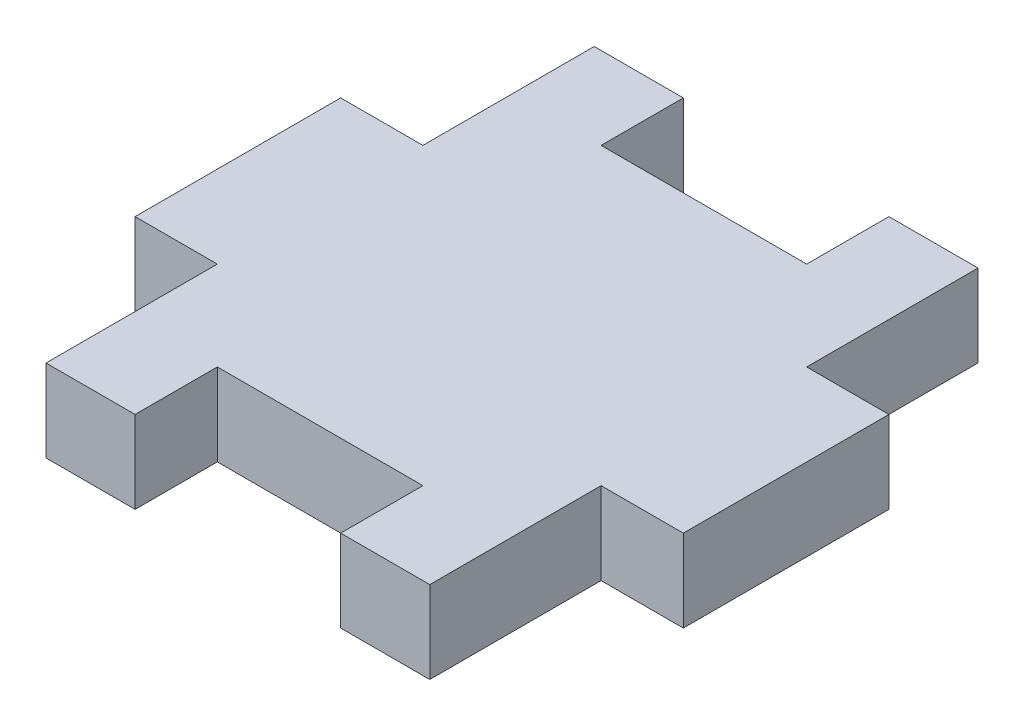
ISO-10303-21;
HEADER;
FILE_DESCRIPTION(('STEP AP214'),'2;1');
FILE_NAME('part.step','',(''),(''),'','','');
FILE_SCHEMA(('AUTOMOTIVE_DESIGN { 1 0 10303 214 1 1 1 1 }'));
ENDSEC;
DATA;
#1=APPLICATION_CONTEXT('core data for automotive mechanical design processes');
#2=APPLICATION_PROTOCOL_DEFINITION('international standard','automotive_design',2000,#1);
#3=PRODUCT_CONTEXT('',#1,'mechanical');
#4=PRODUCT('Part','Part','',(#3));
#5=PRODUCT_RELATED_PRODUCT_CATEGORY('part','',(#4));
#6=PRODUCT_DEFINITION_FORMATION('','',#4);
#7=PRODUCT_DEFINITION_CONTEXT('part definition',#1,'design');
#8=PRODUCT_DEFINITION('design','',#6,#7);
#9=PRODUCT_DEFINITION_SHAPE('','',#8);
#10=(LENGTH_UNIT() NAMED_UNIT(*) SI_UNIT(.MILLI.,.METRE.));
#11=(NAMED_UNIT(*) PLANE_ANGLE_UNIT() SI_UNIT($,.RADIAN.));
#12=(NAMED_UNIT(*) SI_UNIT($,.STERADIAN.) SOLID_ANGLE_UNIT());
#13=UNCERTAINTY_MEASURE_WITH_UNIT(LENGTH_MEASURE(1.E-05),#10,'distance_accuracy_value','');
#14=(GEOMETRIC_REPRESENTATION_CONTEXT(3) GLOBAL_UNCERTAINTY_ASSIGNED_CONTEXT((#13)) GLOBAL_UNIT_ASSIGNED_CONTEXT((#10,
#11,#12)) REPRESENTATION_CONTEXT('',''));
#15=CARTESIAN_POINT('',(0.,0.,0.));
#16=DIRECTION('',(0.,0.,1.));
#17=DIRECTION('',(1.,0.,0.));
#18=AXIS2_PLACEMENT_3D('',#15,#16,#17);
#19=CARTESIAN_POINT('',(0.,6.,0.));
#20=DIRECTION('',(0.,0.,-1.));
#21=DIRECTION('',(-1.,0.,0.));
#22=AXIS2_PLACEMENT_3D('',#19,#20,#21);
#23=PLANE('',#22);
#24=DIRECTION('',(1.,0.,0.));
#25=VECTOR('',#24,1.);
#26=CARTESIAN_POINT('',(0.,0.,0.));
#27=LINE('',#26,#25);
#28=CARTESIAN_POINT('',(6.,0.,0.));
#29=VERTEX_POINT('',#28);
#30=CARTESIAN_POINT('',(12.5,0.,0.));
#31=VERTEX_POINT('',#30);
#32=EDGE_CURVE('E218',#29,#31,#27,.T.);
#33=ORIENTED_EDGE('',*,*,#32,.T.);
#34=DIRECTION('',(0.,-1.,0.));
#35=VECTOR('',#34,1.);
#36=CARTESIAN_POINT('',(12.5,6.,0.));
#37=LINE('',#36,#35);
#38=CARTESIAN_POINT('',(12.5,6.,0.));
#39=VERTEX_POINT('',#38);
#40=EDGE_CURVE('E11',#39,#31,#37,.T.);
#41=ORIENTED_EDGE('',*,*,#40,.F.);
#42=DIRECTION('',(1.,0.,0.));
#43=VECTOR('',#42,1.);
#44=CARTESIAN_POINT('',(0.,6.,0.));
#45=LINE('',#44,#43);
#46=CARTESIAN_POINT('',(6.,6.,0.));
#47=VERTEX_POINT('',#46);
#48=EDGE_CURVE('E286',#47,#39,#45,.T.);
#49=ORIENTED_EDGE('',*,*,#48,.F.);
#50=DIRECTION('',(0.,-1.,0.));
#51=VECTOR('',#50,1.);
#52=CARTESIAN_POINT('',(6.,6.,0.));
#53=LINE('',#52,#51);
#54=EDGE_CURVE('E59',#47,#29,#53,.T.);
#55=ORIENTED_EDGE('',*,*,#54,.T.);
#56=EDGE_LOOP('',(#33,#41,#49,#55));
#57=FACE_BOUND('',#56,.T.);
#58=ADVANCED_FACE('F41',(#57),#23,.F.);
#59=CARTESIAN_POINT('',(12.5,6.,0.));
#60=DIRECTION('',(-1.,0.,0.));
#61=DIRECTION('',(0.,0.,1.));
#62=AXIS2_PLACEMENT_3D('',#59,#60,#61);
#63=PLANE('',#62);
#64=DIRECTION('',(0.,0.,-1.));
#65=VECTOR('',#64,1.);
#66=CARTESIAN_POINT('',(12.5,0.,0.));
#67=LINE('',#66,#65);
#68=CARTESIAN_POINT('',(12.5,0.,-6.));
#69=VERTEX_POINT('',#68);
#70=EDGE_CURVE('E221',#31,#69,#67,.T.);
#71=ORIENTED_EDGE('',*,*,#70,.T.);
#72=DIRECTION('',(0.,-1.,0.));
#73=VECTOR('',#72,1.);
#74=CARTESIAN_POINT('',(12.5,6.,-6.));
#75=LINE('',#74,#73);
#76=CARTESIAN_POINT('',(12.5,6.,-6.));
#77=VERTEX_POINT('',#76);
#78=EDGE_CURVE('E51',#77,#69,#75,.T.);
#79=ORIENTED_EDGE('',*,*,#78,.F.);
#80=DIRECTION('',(0.,0.,-1.));
#81=VECTOR('',#80,1.);
#82=CARTESIAN_POINT('',(12.5,6.,0.));
#83=LINE('',#82,#81);
#84=EDGE_CURVE('E134',#39,#77,#83,.T.);
#85=ORIENTED_EDGE('',*,*,#84,.F.);
#86=ORIENTED_EDGE('',*,*,#40,.T.);
#87=EDGE_LOOP('',(#71,#79,#85,#86));
#88=FACE_BOUND('',#87,.T.);
#89=ADVANCED_FACE('F43',(#88),#63,.F.);
#90=CARTESIAN_POINT('',(0.,6.,-6.));
#91=DIRECTION('',(0.,0.,-1.));
#92=DIRECTION('',(-1.,0.,0.));
#93=AXIS2_PLACEMENT_3D('',#90,#91,#92);
#94=PLANE('',#93);
#95=DIRECTION('',(1.,0.,0.));
#96=VECTOR('',#95,1.);
#97=CARTESIAN_POINT('',(0.,0.,-6.));
#98=LINE('',#97,#96);
#99=CARTESIAN_POINT('',(27.5,0.,-6.));
#100=VERTEX_POINT('',#99);
#101=EDGE_CURVE('E225',#69,#100,#98,.T.);
#102=ORIENTED_EDGE('',*,*,#101,.T.);
#103=DIRECTION('',(0.,-1.,0.));
#104=VECTOR('',#103,1.);
#105=CARTESIAN_POINT('',(27.5,6.,-6.));
#106=LINE('',#105,#104);
#107=CARTESIAN_POINT('',(27.5,6.,-6.));
#108=VERTEX_POINT('',#107);
#109=EDGE_CURVE('E334',#108,#100,#106,.T.);
#110=ORIENTED_EDGE('',*,*,#109,.F.);
#111=DIRECTION('',(1.,0.,0.));
#112=VECTOR('',#111,1.);
#113=CARTESIAN_POINT('',(0.,6.,-6.));
#114=LINE('',#113,#112);
#115=EDGE_CURVE('E343',#77,#108,#114,.T.);
#116=ORIENTED_EDGE('',*,*,#115,.F.);
#117=ORIENTED_EDGE('',*,*,#78,.T.);
#118=EDGE_LOOP('',(#102,#110,#116,#117));
#119=FACE_BOUND('',#118,.T.);
#120=ADVANCED_FACE('F341',(#119),#94,.F.);
#121=CARTESIAN_POINT('',(27.5,6.,0.));
#122=DIRECTION('',(-1.,0.,0.));
#123=DIRECTION('',(0.,0.,1.));
#124=AXIS2_PLACEMENT_3D('',#121,#122,#123);
#125=PLANE('',#124);
#126=DIRECTION('',(0.,0.,-1.));
#127=VECTOR('',#126,1.);
#128=CARTESIAN_POINT('',(27.5,0.,0.));
#129=LINE('',#128,#127);
#130=CARTESIAN_POINT('',(27.5,0.,0.));
#131=VERTEX_POINT('',#130);
#132=EDGE_CURVE('E229',#131,#100,#129,.T.);
#133=ORIENTED_EDGE('',*,*,#132,.F.);
#134=DIRECTION('',(0.,-1.,0.));
#135=VECTOR('',#134,1.);
#136=CARTESIAN_POINT('',(27.5,6.,0.));
#137=LINE('',#136,#135);
#138=CARTESIAN_POINT('',(27.5,6.,0.));
#139=VERTEX_POINT('',#138);
#140=EDGE_CURVE('E331',#139,#131,#137,.T.);
#141=ORIENTED_EDGE('',*,*,#140,.F.);
#142=DIRECTION('',(0.,0.,-1.));
#143=VECTOR('',#142,1.);
#144=CARTESIAN_POINT('',(27.5,6.,0.));
#145=LINE('',#144,#143);
#146=EDGE_CURVE('E354',#139,#108,#145,.T.);
#147=ORIENTED_EDGE('',*,*,#146,.T.);
#148=ORIENTED_EDGE('',*,*,#109,.T.);
#149=EDGE_LOOP('',(#133,#141,#147,#148));
#150=FACE_BOUND('',#149,.T.);
#151=ADVANCED_FACE('F350',(#150),#125,.T.);
#152=CARTESIAN_POINT('',(34.,0.,0.));
#153=VERTEX_POINT('',#152);
#154=EDGE_CURVE('E222',#131,#153,#27,.T.);
#155=ORIENTED_EDGE('',*,*,#154,.T.);
#156=DIRECTION('',(0.,-1.,0.));
#157=VECTOR('',#156,1.);
#158=CARTESIAN_POINT('',(34.,6.,0.));
#159=LINE('',#158,#157);
#160=CARTESIAN_POINT('',(34.,6.,0.));
#161=VERTEX_POINT('',#160);
#162=EDGE_CURVE('E327',#161,#153,#159,.T.);
#163=ORIENTED_EDGE('',*,*,#162,.F.);
#164=EDGE_CURVE('E356',#139,#161,#45,.T.);
#165=ORIENTED_EDGE('',*,*,#164,.F.);
#166=ORIENTED_EDGE('',*,*,#140,.T.);
#167=EDGE_LOOP('',(#155,#163,#165,#166));
#168=FACE_BOUND('',#167,.T.);
#169=ADVANCED_FACE('F417',(#168),#23,.F.);
#170=CARTESIAN_POINT('',(34.,6.,0.));
#171=DIRECTION('',(-1.,0.,0.));
#172=DIRECTION('',(0.,0.,1.));
#173=AXIS2_PLACEMENT_3D('',#170,#171,#172);
#174=PLANE('',#173);
#175=DIRECTION('',(0.,0.,-1.));
#176=VECTOR('',#175,1.);
#177=CARTESIAN_POINT('',(34.,0.,0.));
#178=LINE('',#177,#176);
#179=CARTESIAN_POINT('',(34.,0.,-12.5));
#180=VERTEX_POINT('',#179);
#181=EDGE_CURVE('E233',#153,#180,#178,.T.);
#182=ORIENTED_EDGE('',*,*,#181,.T.);
#183=DIRECTION('',(0.,-1.,0.));
#184=VECTOR('',#183,1.);
#185=CARTESIAN_POINT('',(34.,6.,-12.5));
#186=LINE('',#185,#184);
#187=CARTESIAN_POINT('',(34.,6.,-12.5));
#188=VERTEX_POINT('',#187);
#189=EDGE_CURVE('E324',#188,#180,#186,.T.);
#190=ORIENTED_EDGE('',*,*,#189,.F.);
#191=DIRECTION('',(0.,0.,-1.));
#192=VECTOR('',#191,1.);
#193=CARTESIAN_POINT('',(34.,6.,0.));
#194=LINE('',#193,#192);
#195=EDGE_CURVE('E360',#161,#188,#194,.T.);
#196=ORIENTED_EDGE('',*,*,#195,.F.);
#197=ORIENTED_EDGE('',*,*,#162,.T.);
#198=EDGE_LOOP('',(#182,#190,#196,#197));
#199=FACE_BOUND('',#198,.T.);
#200=ADVANCED_FACE('F420',(#199),#174,.F.);
#201=CARTESIAN_POINT('',(0.,6.,-12.5));
#202=DIRECTION('',(0.,0.,1.));
#203=DIRECTION('',(1.,0.,0.));
#204=AXIS2_PLACEMENT_3D('',#201,#202,#203);
#205=PLANE('',#204);
#206=DIRECTION('',(-1.,0.,0.));
#207=VECTOR('',#206,1.);
#208=CARTESIAN_POINT('',(0.,0.,-12.5));
#209=LINE('',#208,#207);
#210=CARTESIAN_POINT('',(40.,0.,-12.5));
#211=VERTEX_POINT('',#210);
#212=EDGE_CURVE('E237',#211,#180,#209,.T.);
#213=ORIENTED_EDGE('',*,*,#212,.F.);
#214=DIRECTION('',(0.,-1.,0.));
#215=VECTOR('',#214,1.);
#216=CARTESIAN_POINT('',(40.,6.,-12.5));
#217=LINE('',#216,#215);
#218=CARTESIAN_POINT('',(40.,6.,-12.5));
#219=VERTEX_POINT('',#218);
#220=EDGE_CURVE('E321',#219,#211,#217,.T.);
#221=ORIENTED_EDGE('',*,*,#220,.F.);
#222=DIRECTION('',(-1.,0.,0.));
#223=VECTOR('',#222,1.);
#224=CARTESIAN_POINT('',(0.,6.,-12.5));
#225=LINE('',#224,#223);
#226=EDGE_CURVE('E367',#219,#188,#225,.T.);
#227=ORIENTED_EDGE('',*,*,#226,.T.);
#228=ORIENTED_EDGE('',*,*,#189,.T.);
#229=EDGE_LOOP('',(#213,#221,#227,#228));
#230=FACE_BOUND('',#229,.T.);
#231=ADVANCED_FACE('F426',(#230),#205,.T.);
#232=CARTESIAN_POINT('',(40.,6.,0.));
#233=DIRECTION('',(-1.,0.,0.));
#234=DIRECTION('',(0.,0.,1.));
#235=AXIS2_PLACEMENT_3D('',#232,#233,#234);
#236=PLANE('',#235);
#237=DIRECTION('',(0.,0.,-1.));
#238=VECTOR('',#237,1.);
#239=CARTESIAN_POINT('',(40.,0.,0.));
#240=LINE('',#239,#238);
#241=CARTESIAN_POINT('',(40.,0.,-27.5));
#242=VERTEX_POINT('',#241);
#243=EDGE_CURVE('E241',#211,#242,#240,.T.);
#244=ORIENTED_EDGE('',*,*,#243,.T.);
#245=DIRECTION('',(0.,-1.,0.));
#246=VECTOR('',#245,1.);
#247=CARTESIAN_POINT('',(40.,6.,-27.5));
#248=LINE('',#247,#246);
#249=CARTESIAN_POINT('',(40.,6.,-27.5));
#250=VERTEX_POINT('',#249);
#251=EDGE_CURVE('E317',#250,#242,#248,.T.);
#252=ORIENTED_EDGE('',*,*,#251,.F.);
#253=DIRECTION('',(0.,0.,-1.));
#254=VECTOR('',#253,1.);
#255=CARTESIAN_POINT('',(40.,6.,0.));
#256=LINE('',#255,#254);
#257=EDGE_CURVE('E371',#219,#250,#256,.T.);
#258=ORIENTED_EDGE('',*,*,#257,.F.);
#259=ORIENTED_EDGE('',*,*,#220,.T.);
#260=EDGE_LOOP('',(#244,#252,#258,#259));
#261=FACE_BOUND('',#260,.T.);
#262=ADVANCED_FACE('F434',(#261),#236,.F.);
#263=CARTESIAN_POINT('',(0.,6.,-27.5));
#264=DIRECTION('',(0.,0.,1.));
#265=DIRECTION('',(1.,0.,0.));
#266=AXIS2_PLACEMENT_3D('',#263,#264,#265);
#267=PLANE('',#266);
#268=DIRECTION('',(-1.,0.,0.));
#269=VECTOR('',#268,1.);
#270=CARTESIAN_POINT('',(0.,0.,-27.5));
#271=LINE('',#270,#269);
#272=CARTESIAN_POINT('',(34.,0.,-27.5));
#273=VERTEX_POINT('',#272);
#274=EDGE_CURVE('E244',#242,#273,#271,.T.);
#275=ORIENTED_EDGE('',*,*,#274,.T.);
#276=DIRECTION('',(0.,-1.,0.));
#277=VECTOR('',#276,1.);
#278=CARTESIAN_POINT('',(34.,6.,-27.5));
#279=LINE('',#278,#277);
#280=CARTESIAN_POINT('',(34.,6.,-27.5));
#281=VERTEX_POINT('',#280);
#282=EDGE_CURVE('E314',#281,#273,#279,.T.);
#283=ORIENTED_EDGE('',*,*,#282,.F.);
#284=DIRECTION('',(-1.,0.,0.));
#285=VECTOR('',#284,1.);
#286=CARTESIAN_POINT('',(0.,6.,-27.5));
#287=LINE('',#286,#285);
#288=EDGE_CURVE('E374',#250,#281,#287,.T.);
#289=ORIENTED_EDGE('',*,*,#288,.F.);
#290=ORIENTED_EDGE('',*,*,#251,.T.);
#291=EDGE_LOOP('',(#275,#283,#289,#290));
#292=FACE_BOUND('',#291,.T.);
#293=ADVANCED_FACE('F436',(#292),#267,.F.);
#294=CARTESIAN_POINT('',(34.,6.,0.));
#295=DIRECTION('',(1.,0.,0.));
#296=DIRECTION('',(0.,0.,-1.));
#297=AXIS2_PLACEMENT_3D('',#294,#295,#296);
#298=PLANE('',#297);
#299=DIRECTION('',(0.,0.,1.));
#300=VECTOR('',#299,1.);
#301=CARTESIAN_POINT('',(34.,0.,0.));
#302=LINE('',#301,#300);
#303=CARTESIAN_POINT('',(34.,0.,-40.));
#304=VERTEX_POINT('',#303);
#305=EDGE_CURVE('E248',#304,#273,#302,.T.);
#306=ORIENTED_EDGE('',*,*,#305,.F.);
#307=DIRECTION('',(0.,-1.,0.));
#308=VECTOR('',#307,1.);
#309=CARTESIAN_POINT('',(34.,6.,-40.));
#310=LINE('',#309,#308);
#311=CARTESIAN_POINT('',(34.,6.,-40.));
#312=VERTEX_POINT('',#311);
#313=EDGE_CURVE('E311',#312,#304,#310,.T.);
#314=ORIENTED_EDGE('',*,*,#313,.F.);
#315=DIRECTION('',(0.,0.,1.));
#316=VECTOR('',#315,1.);
#317=CARTESIAN_POINT('',(34.,6.,0.));
#318=LINE('',#317,#316);
#319=EDGE_CURVE('E377',#312,#281,#318,.T.);
#320=ORIENTED_EDGE('',*,*,#319,.T.);
#321=ORIENTED_EDGE('',*,*,#282,.T.);
#322=EDGE_LOOP('',(#306,#314,#320,#321));
#323=FACE_BOUND('',#322,.T.);
#324=ADVANCED_FACE('F439',(#323),#298,.T.);
#325=CARTESIAN_POINT('',(0.,6.,-40.));
#326=DIRECTION('',(0.,0.,-1.));
#327=DIRECTION('',(-1.,0.,0.));
#328=AXIS2_PLACEMENT_3D('',#325,#326,#327);
#329=PLANE('',#328);
#330=DIRECTION('',(1.,0.,0.));
#331=VECTOR('',#330,1.);
#332=CARTESIAN_POINT('',(0.,0.,-40.));
#333=LINE('',#332,#331);
#334=CARTESIAN_POINT('',(27.5,0.,-40.));
#335=VERTEX_POINT('',#334);
#336=EDGE_CURVE('E252',#335,#304,#333,.T.);
#337=ORIENTED_EDGE('',*,*,#336,.F.);
#338=DIRECTION('',(0.,-1.,0.));
#339=VECTOR('',#338,1.);
#340=CARTESIAN_POINT('',(27.5,6.,-40.));
#341=LINE('',#340,#339);
#342=CARTESIAN_POINT('',(27.5,6.,-40.));
#343=VERTEX_POINT('',#342);
#344=EDGE_CURVE('E308',#343,#335,#341,.T.);
#345=ORIENTED_EDGE('',*,*,#344,.F.);
#346=DIRECTION('',(1.,0.,0.));
#347=VECTOR('',#346,1.);
#348=CARTESIAN_POINT('',(0.,6.,-40.));
#349=LINE('',#348,#347);
#350=EDGE_CURVE('E381',#343,#312,#349,.T.);
#351=ORIENTED_EDGE('',*,*,#350,.T.);
#352=ORIENTED_EDGE('',*,*,#313,.T.);
#353=EDGE_LOOP('',(#337,#345,#351,#352));
#354=FACE_BOUND('',#353,.T.);
#355=ADVANCED_FACE('F443',(#354),#329,.T.);
#356=CARTESIAN_POINT('',(27.5,6.,0.));
#357=DIRECTION('',(1.,0.,0.));
#358=DIRECTION('',(0.,0.,-1.));
#359=AXIS2_PLACEMENT_3D('',#356,#357,#358);
#360=PLANE('',#359);
#361=DIRECTION('',(0.,0.,1.));
#362=VECTOR('',#361,1.);
#363=CARTESIAN_POINT('',(27.5,0.,0.));
#364=LINE('',#363,#362);
#365=CARTESIAN_POINT('',(27.5,0.,-34.));
#366=VERTEX_POINT('',#365);
#367=EDGE_CURVE('E256',#335,#366,#364,.T.);
#368=ORIENTED_EDGE('',*,*,#367,.T.);
#369=DIRECTION('',(0.,-1.,0.));
#370=VECTOR('',#369,1.);
#371=CARTESIAN_POINT('',(27.5,6.,-34.));
#372=LINE('',#371,#370);
#373=CARTESIAN_POINT('',(27.5,6.,-34.));
#374=VERTEX_POINT('',#373);
#375=EDGE_CURVE('E305',#374,#366,#372,.T.);
#376=ORIENTED_EDGE('',*,*,#375,.F.);
#377=DIRECTION('',(0.,0.,1.));
#378=VECTOR('',#377,1.);
#379=CARTESIAN_POINT('',(27.5,6.,0.));
#380=LINE('',#379,#378);
#381=EDGE_CURVE('E385',#343,#374,#380,.T.);
#382=ORIENTED_EDGE('',*,*,#381,.F.);
#383=ORIENTED_EDGE('',*,*,#344,.T.);
#384=EDGE_LOOP('',(#368,#376,#382,#383));
#385=FACE_BOUND('',#384,.T.);
#386=ADVANCED_FACE('F448',(#385),#360,.F.);
#387=CARTESIAN_POINT('',(0.,6.,-34.));
#388=DIRECTION('',(0.,0.,-1.));
#389=DIRECTION('',(-1.,0.,0.));
#390=AXIS2_PLACEMENT_3D('',#387,#388,#389);
#391=PLANE('',#390);
#392=DIRECTION('',(1.,0.,0.));
#393=VECTOR('',#392,1.);
#394=CARTESIAN_POINT('',(0.,0.,-34.));
#395=LINE('',#394,#393);
#396=CARTESIAN_POINT('',(12.5,0.,-34.));
#397=VERTEX_POINT('',#396);
#398=EDGE_CURVE('E261',#397,#366,#395,.T.);
#399=ORIENTED_EDGE('',*,*,#398,.F.);
#400=DIRECTION('',(0.,-1.,0.));
#401=VECTOR('',#400,1.);
#402=CARTESIAN_POINT('',(12.5,6.,-34.));
#403=LINE('',#402,#401);
#404=CARTESIAN_POINT('',(12.5,6.,-34.));
#405=VERTEX_POINT('',#404);
#406=EDGE_CURVE('E302',#405,#397,#403,.T.);
#407=ORIENTED_EDGE('',*,*,#406,.F.);
#408=DIRECTION('',(1.,0.,0.));
#409=VECTOR('',#408,1.);
#410=CARTESIAN_POINT('',(0.,6.,-34.));
#411=LINE('',#410,#409);
#412=EDGE_CURVE('E389',#405,#374,#411,.T.);
#413=ORIENTED_EDGE('',*,*,#412,.T.);
#414=ORIENTED_EDGE('',*,*,#375,.T.);
#415=EDGE_LOOP('',(#399,#407,#413,#414));
#416=FACE_BOUND('',#415,.T.);
#417=ADVANCED_FACE('F450',(#416),#391,.T.);
#418=CARTESIAN_POINT('',(12.5,6.,0.));
#419=DIRECTION('',(1.,0.,0.));
#420=DIRECTION('',(0.,0.,-1.));
#421=AXIS2_PLACEMENT_3D('',#418,#419,#420);
#422=PLANE('',#421);
#423=DIRECTION('',(0.,0.,1.));
#424=VECTOR('',#423,1.);
#425=CARTESIAN_POINT('',(12.5,0.,0.));
#426=LINE('',#425,#424);
#427=CARTESIAN_POINT('',(12.5,0.,-40.));
#428=VERTEX_POINT('',#427);
#429=EDGE_CURVE('E265',#428,#397,#426,.T.);
#430=ORIENTED_EDGE('',*,*,#429,.F.);
#431=DIRECTION('',(0.,-1.,0.));
#432=VECTOR('',#431,1.);
#433=CARTESIAN_POINT('',(12.5,6.,-40.));
#434=LINE('',#433,#432);
#435=CARTESIAN_POINT('',(12.5,6.,-40.));
#436=VERTEX_POINT('',#435);
#437=EDGE_CURVE('E299',#436,#428,#434,.T.);
#438=ORIENTED_EDGE('',*,*,#437,.F.);
#439=DIRECTION('',(0.,0.,1.));
#440=VECTOR('',#439,1.);
#441=CARTESIAN_POINT('',(12.5,6.,0.));
#442=LINE('',#441,#440);
#443=EDGE_CURVE('E393',#436,#405,#442,.T.);
#444=ORIENTED_EDGE('',*,*,#443,.T.);
#445=ORIENTED_EDGE('',*,*,#406,.T.);
#446=EDGE_LOOP('',(#430,#438,#444,#445));
#447=FACE_BOUND('',#446,.T.);
#448=ADVANCED_FACE('F409',(#447),#422,.T.);
#449=CARTESIAN_POINT('',(6.,0.,-40.));
#450=VERTEX_POINT('',#449);
#451=EDGE_CURVE('E257',#450,#428,#333,.T.);
#452=ORIENTED_EDGE('',*,*,#451,.F.);
#453=DIRECTION('',(0.,-1.,0.));
#454=VECTOR('',#453,1.);
#455=CARTESIAN_POINT('',(6.,6.,-40.));
#456=LINE('',#455,#454);
#457=CARTESIAN_POINT('',(6.,6.,-40.));
#458=VERTEX_POINT('',#457);
#459=EDGE_CURVE('E296',#458,#450,#456,.T.);
#460=ORIENTED_EDGE('',*,*,#459,.F.);
#461=EDGE_CURVE('E386',#458,#436,#349,.T.);
#462=ORIENTED_EDGE('',*,*,#461,.T.);
#463=ORIENTED_EDGE('',*,*,#437,.T.);
#464=EDGE_LOOP('',(#452,#460,#462,#463));
#465=FACE_BOUND('',#464,.T.);
#466=ADVANCED_FACE('F404',(#465),#329,.T.);
#467=CARTESIAN_POINT('',(6.00000000000001,6.,0.));
#468=DIRECTION('',(1.,0.,0.));
#469=DIRECTION('',(0.,0.,-1.));
#470=AXIS2_PLACEMENT_3D('',#467,#468,#469);
#471=PLANE('',#470);
#472=DIRECTION('',(0.,0.,1.));
#473=VECTOR('',#472,1.);
#474=CARTESIAN_POINT('',(6.00000000000001,0.,0.));
#475=LINE('',#474,#473);
#476=CARTESIAN_POINT('',(6.,0.,-27.5));
#477=VERTEX_POINT('',#476);
#478=EDGE_CURVE('E269',#450,#477,#475,.T.);
#479=ORIENTED_EDGE('',*,*,#478,.T.);
#480=DIRECTION('',(0.,-1.,0.));
#481=VECTOR('',#480,1.);
#482=CARTESIAN_POINT('',(6.,6.,-27.5));
#483=LINE('',#482,#481);
#484=CARTESIAN_POINT('',(6.,6.,-27.5));
#485=VERTEX_POINT('',#484);
#486=EDGE_CURVE('E293',#485,#477,#483,.T.);
#487=ORIENTED_EDGE('',*,*,#486,.F.);
#488=DIRECTION('',(0.,0.,1.));
#489=VECTOR('',#488,1.);
#490=CARTESIAN_POINT('',(6.00000000000001,6.,0.));
#491=LINE('',#490,#489);
#492=EDGE_CURVE('E212',#458,#485,#491,.T.);
#493=ORIENTED_EDGE('',*,*,#492,.F.);
#494=ORIENTED_EDGE('',*,*,#459,.T.);
#495=EDGE_LOOP('',(#479,#487,#493,#494));
#496=FACE_BOUND('',#495,.T.);
#497=ADVANCED_FACE('F558',(#496),#471,.F.);
#498=CARTESIAN_POINT('',(0.,6.,-27.5));
#499=DIRECTION('',(0.,0.,-1.));
#500=DIRECTION('',(-1.,0.,0.));
#501=AXIS2_PLACEMENT_3D('',#498,#499,#500);
#502=PLANE('',#501);
#503=DIRECTION('',(1.,0.,0.));
#504=VECTOR('',#503,1.);
#505=CARTESIAN_POINT('',(0.,0.,-27.5));
#506=LINE('',#505,#504);
#507=CARTESIAN_POINT('',(0.,0.,-27.5));
#508=VERTEX_POINT('',#507);
#509=EDGE_CURVE('E273',#508,#477,#506,.T.);
#510=ORIENTED_EDGE('',*,*,#509,.F.);
#511=DIRECTION('',(0.,-1.,0.));
#512=VECTOR('',#511,1.);
#513=CARTESIAN_POINT('',(0.,6.,-27.5));
#514=LINE('',#513,#512);
#515=CARTESIAN_POINT('',(0.,6.,-27.5));
#516=VERTEX_POINT('',#515);
#517=EDGE_CURVE('E196',#516,#508,#514,.T.);
#518=ORIENTED_EDGE('',*,*,#517,.F.);
#519=DIRECTION('',(1.,0.,0.));
#520=VECTOR('',#519,1.);
#521=CARTESIAN_POINT('',(0.,6.,-27.5));
#522=LINE('',#521,#520);
#523=EDGE_CURVE('E208',#516,#485,#522,.T.);
#524=ORIENTED_EDGE('',*,*,#523,.T.);
#525=ORIENTED_EDGE('',*,*,#486,.T.);
#526=EDGE_LOOP('',(#510,#518,#524,#525));
#527=FACE_BOUND('',#526,.T.);
#528=ADVANCED_FACE('F565',(#527),#502,.T.);
#529=CARTESIAN_POINT('',(0.,6.,0.));
#530=DIRECTION('',(-1.,0.,0.));
#531=DIRECTION('',(0.,0.,1.));
#532=AXIS2_PLACEMENT_3D('',#529,#530,#531);
#533=PLANE('',#532);
#534=DIRECTION('',(0.,0.,-1.));
#535=VECTOR('',#534,1.);
#536=CARTESIAN_POINT('',(0.,0.,0.));
#537=LINE('',#536,#535);
#538=CARTESIAN_POINT('',(0.,0.,-12.5));
#539=VERTEX_POINT('',#538);
#540=EDGE_CURVE('E192',#539,#508,#537,.T.);
#541=ORIENTED_EDGE('',*,*,#540,.F.);
#542=DIRECTION('',(0.,-1.,0.));
#543=VECTOR('',#542,1.);
#544=CARTESIAN_POINT('',(0.,6.,-12.5));
#545=LINE('',#544,#543);
#546=CARTESIAN_POINT('',(0.,6.,-12.5));
#547=VERTEX_POINT('',#546);
#548=EDGE_CURVE('E186',#547,#539,#545,.T.);
#549=ORIENTED_EDGE('',*,*,#548,.F.);
#550=DIRECTION('',(0.,0.,-1.));
#551=VECTOR('',#550,1.);
#552=CARTESIAN_POINT('',(0.,6.,0.));
#553=LINE('',#552,#551);
#554=EDGE_CURVE('E190',#547,#516,#553,.T.);
#555=ORIENTED_EDGE('',*,*,#554,.T.);
#556=ORIENTED_EDGE('',*,*,#517,.T.);
#557=EDGE_LOOP('',(#541,#549,#555,#556));
#558=FACE_BOUND('',#557,.T.);
#559=ADVANCED_FACE('F188',(#558),#533,.T.);
#560=CARTESIAN_POINT('',(0.,6.,-12.5));
#561=DIRECTION('',(0.,0.,-1.));
#562=DIRECTION('',(-1.,0.,0.));
#563=AXIS2_PLACEMENT_3D('',#560,#561,#562);
#564=PLANE('',#563);
#565=DIRECTION('',(1.,0.,0.));
#566=VECTOR('',#565,1.);
#567=CARTESIAN_POINT('',(0.,0.,-12.5));
#568=LINE('',#567,#566);
#569=CARTESIAN_POINT('',(6.,0.,-12.5));
#570=VERTEX_POINT('',#569);
#571=EDGE_CURVE('E279',#539,#570,#568,.T.);
#572=ORIENTED_EDGE('',*,*,#571,.T.);
#573=DIRECTION('',(0.,-1.,0.));
#574=VECTOR('',#573,1.);
#575=CARTESIAN_POINT('',(6.,6.,-12.5));
#576=LINE('',#575,#574);
#577=CARTESIAN_POINT('',(6.,6.,-12.5));
#578=VERTEX_POINT('',#577);
#579=EDGE_CURVE('E122',#578,#570,#576,.T.);
#580=ORIENTED_EDGE('',*,*,#579,.F.);
#581=DIRECTION('',(1.,0.,0.));
#582=VECTOR('',#581,1.);
#583=CARTESIAN_POINT('',(0.,6.,-12.5));
#584=LINE('',#583,#582);
#585=EDGE_CURVE('E198',#547,#578,#584,.T.);
#586=ORIENTED_EDGE('',*,*,#585,.F.);
#587=ORIENTED_EDGE('',*,*,#548,.T.);
#588=EDGE_LOOP('',(#572,#580,#586,#587));
#589=FACE_BOUND('',#588,.T.);
#590=ADVANCED_FACE('F199',(#589),#564,.F.);
#591=CARTESIAN_POINT('',(6.,6.,0.));
#592=DIRECTION('',(-1.,0.,0.));
#593=DIRECTION('',(0.,0.,1.));
#594=AXIS2_PLACEMENT_3D('',#591,#592,#593);
#595=PLANE('',#594);
#596=DIRECTION('',(0.,0.,-1.));
#597=VECTOR('',#596,1.);
#598=CARTESIAN_POINT('',(6.,0.,0.));
#599=LINE('',#598,#597);
#600=EDGE_CURVE('E282',#29,#570,#599,.T.);
#601=ORIENTED_EDGE('',*,*,#600,.F.);
#602=ORIENTED_EDGE('',*,*,#54,.F.);
#603=DIRECTION('',(0.,0.,-1.));
#604=VECTOR('',#603,1.);
#605=CARTESIAN_POINT('',(6.,6.,0.));
#606=LINE('',#605,#604);
#607=EDGE_CURVE('E203',#47,#578,#606,.T.);
#608=ORIENTED_EDGE('',*,*,#607,.T.);
#609=ORIENTED_EDGE('',*,*,#579,.T.);
#610=EDGE_LOOP('',(#601,#602,#608,#609));
#611=FACE_BOUND('',#610,.T.);
#612=ADVANCED_FACE('F589',(#611),#595,.T.);
#613=CARTESIAN_POINT('',(0.,6.,0.));
#614=DIRECTION('',(0.,1.,0.));
#615=DIRECTION('',(0.,0.,1.));
#616=AXIS2_PLACEMENT_3D('',#613,#614,#615);
#617=PLANE('',#616);
#618=ORIENTED_EDGE('',*,*,#48,.T.);
#619=ORIENTED_EDGE('',*,*,#84,.T.);
#620=ORIENTED_EDGE('',*,*,#115,.T.);
#621=ORIENTED_EDGE('',*,*,#146,.F.);
#622=ORIENTED_EDGE('',*,*,#164,.T.);
#623=ORIENTED_EDGE('',*,*,#195,.T.);
#624=ORIENTED_EDGE('',*,*,#226,.F.);
#625=ORIENTED_EDGE('',*,*,#257,.T.);
#626=ORIENTED_EDGE('',*,*,#288,.T.);
#627=ORIENTED_EDGE('',*,*,#319,.F.);
#628=ORIENTED_EDGE('',*,*,#350,.F.);
#629=ORIENTED_EDGE('',*,*,#381,.T.);
#630=ORIENTED_EDGE('',*,*,#412,.F.);
#631=ORIENTED_EDGE('',*,*,#443,.F.);
#632=ORIENTED_EDGE('',*,*,#461,.F.);
#633=ORIENTED_EDGE('',*,*,#492,.T.);
#634=ORIENTED_EDGE('',*,*,#523,.F.);
#635=ORIENTED_EDGE('',*,*,#554,.F.);
#636=ORIENTED_EDGE('',*,*,#585,.T.);
#637=ORIENTED_EDGE('',*,*,#607,.F.);
#638=EDGE_LOOP('',(#618,#619,#620,#621,#622,#623,#624,#625,#626,#627,#628,#629,#630,#631,#632,
#633,#634,#635,#636,#637));
#639=FACE_BOUND('',#638,.T.);
#640=ADVANCED_FACE('F206',(#639),#617,.T.);
#641=CARTESIAN_POINT('',(0.,0.,0.));
#642=DIRECTION('',(0.,1.,0.));
#643=DIRECTION('',(0.,0.,1.));
#644=AXIS2_PLACEMENT_3D('',#641,#642,#643);
#645=PLANE('',#644);
#646=ORIENTED_EDGE('',*,*,#32,.F.);
#647=ORIENTED_EDGE('',*,*,#600,.T.);
#648=ORIENTED_EDGE('',*,*,#571,.F.);
#649=ORIENTED_EDGE('',*,*,#540,.T.);
#650=ORIENTED_EDGE('',*,*,#509,.T.);
#651=ORIENTED_EDGE('',*,*,#478,.F.);
#652=ORIENTED_EDGE('',*,*,#451,.T.);
#653=ORIENTED_EDGE('',*,*,#429,.T.);
#654=ORIENTED_EDGE('',*,*,#398,.T.);
#655=ORIENTED_EDGE('',*,*,#367,.F.);
#656=ORIENTED_EDGE('',*,*,#336,.T.);
#657=ORIENTED_EDGE('',*,*,#305,.T.);
#658=ORIENTED_EDGE('',*,*,#274,.F.);
#659=ORIENTED_EDGE('',*,*,#243,.F.);
#660=ORIENTED_EDGE('',*,*,#212,.T.);
#661=ORIENTED_EDGE('',*,*,#181,.F.);
#662=ORIENTED_EDGE('',*,*,#154,.F.);
#663=ORIENTED_EDGE('',*,*,#132,.T.);
#664=ORIENTED_EDGE('',*,*,#101,.F.);
#665=ORIENTED_EDGE('',*,*,#70,.F.);
#666=EDGE_LOOP('',(#646,#647,#648,#649,#650,#651,#652,#653,#654,#655,#656,#657,#658,#659,#660,
#661,#662,#663,#664,#665));
#667=FACE_BOUND('',#666,.T.);
#668=ADVANCED_FACE('F345',(#667),#645,.F.);
#669=CLOSED_SHELL('',(#58,#89,#120,#151,#169,#200,#231,#262,#293,#324,#355,#386,#417,#448,#466,
#497,#528,#559,#590,#612,#640,#668));
#670=MANIFOLD_SOLID_BREP('B2',#669);
#671=ADVANCED_BREP_SHAPE_REPRESENTATION('',(#18,#670),#14);
#672=SHAPE_DEFINITION_REPRESENTATION(#9,#671);
ENDSEC;
END-ISO-10303-21;
